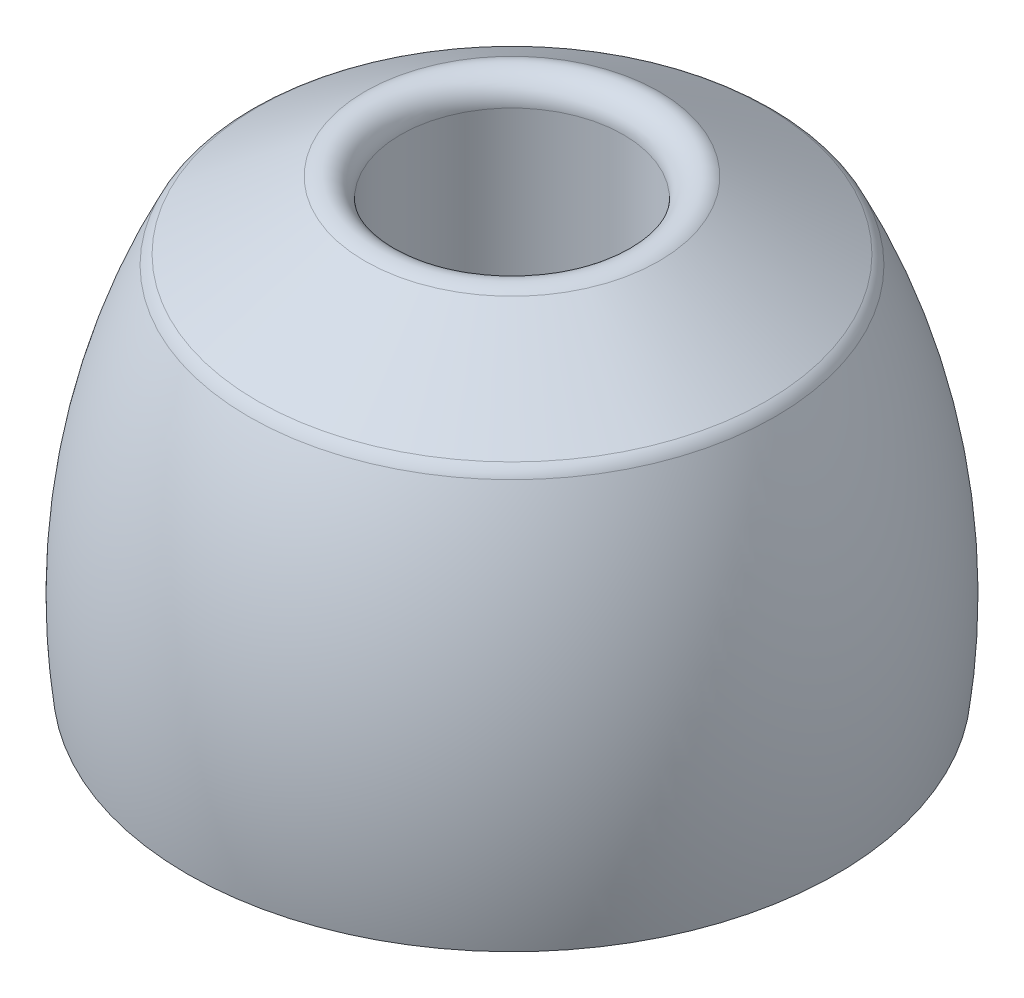
ISO-10303-21;
HEADER;
FILE_DESCRIPTION(('STEP AP214'),'2;1');
FILE_NAME('part.step','',(''),(''),'','','');
FILE_SCHEMA(('AUTOMOTIVE_DESIGN { 1 0 10303 214 1 1 1 1 }'));
ENDSEC;
DATA;
#1=APPLICATION_CONTEXT('core data for automotive mechanical design processes');
#2=APPLICATION_PROTOCOL_DEFINITION('international standard','automotive_design',2000,#1);
#3=PRODUCT_CONTEXT('',#1,'mechanical');
#4=PRODUCT('Part','Part','',(#3));
#5=PRODUCT_RELATED_PRODUCT_CATEGORY('part','',(#4));
#6=PRODUCT_DEFINITION_FORMATION('','',#4);
#7=PRODUCT_DEFINITION_CONTEXT('part definition',#1,'design');
#8=PRODUCT_DEFINITION('design','',#6,#7);
#9=PRODUCT_DEFINITION_SHAPE('','',#8);
#10=(LENGTH_UNIT() NAMED_UNIT(*) SI_UNIT(.MILLI.,.METRE.));
#11=(NAMED_UNIT(*) PLANE_ANGLE_UNIT() SI_UNIT($,.RADIAN.));
#12=(NAMED_UNIT(*) SI_UNIT($,.STERADIAN.) SOLID_ANGLE_UNIT());
#13=UNCERTAINTY_MEASURE_WITH_UNIT(LENGTH_MEASURE(1.E-05),#10,'distance_accuracy_value','');
#14=(GEOMETRIC_REPRESENTATION_CONTEXT(3) GLOBAL_UNCERTAINTY_ASSIGNED_CONTEXT((#13)) GLOBAL_UNIT_ASSIGNED_CONTEXT((#10,
#11,#12)) REPRESENTATION_CONTEXT('',''));
#15=CARTESIAN_POINT('',(0.,0.,0.));
#16=DIRECTION('',(0.,0.,1.));
#17=DIRECTION('',(1.,0.,0.));
#18=AXIS2_PLACEMENT_3D('',#15,#16,#17);
#19=CARTESIAN_POINT('',(0.,0.,0.));
#20=DIRECTION('',(0.,1.,0.));
#21=DIRECTION('',(0.,0.,1.));
#22=AXIS2_PLACEMENT_3D('',#19,#20,#21);
#23=CYLINDRICAL_SURFACE('',#22,2.4);
#24=CARTESIAN_POINT('',(0.,7.59651913615297,0.));
#25=DIRECTION('',(0.,-1.,0.));
#26=DIRECTION('',(0.,0.,-1.));
#27=AXIS2_PLACEMENT_3D('',#24,#25,#26);
#28=CIRCLE('',#27,2.4);
#29=CARTESIAN_POINT('',(0.,7.59651913615297,-2.4));
#30=VERTEX_POINT('',#29);
#31=EDGE_CURVE('E64',#30,#30,#28,.F.);
#32=ORIENTED_EDGE('',*,*,#31,.T.);
#33=EDGE_LOOP('',(#32));
#34=FACE_BOUND('',#33,.T.);
#35=CARTESIAN_POINT('',(0.,0.5,0.));
#36=DIRECTION('',(0.,1.,0.));
#37=DIRECTION('',(0.,0.,1.));
#38=AXIS2_PLACEMENT_3D('',#35,#36,#37);
#39=CIRCLE('',#38,2.4);
#40=CARTESIAN_POINT('',(0.,0.5,2.4));
#41=VERTEX_POINT('',#40);
#42=EDGE_CURVE('E69',#41,#41,#39,.T.);
#43=ORIENTED_EDGE('',*,*,#42,.F.);
#44=EDGE_LOOP('',(#43));
#45=FACE_BOUND('',#44,.T.);
#46=ADVANCED_FACE('F51',(#34,#45),#23,.F.);
#47=CARTESIAN_POINT('',(0.,8.5,0.));
#48=DIRECTION('',(0.,-1.,0.));
#49=DIRECTION('',(0.,0.,-1.));
#50=AXIS2_PLACEMENT_3D('',#47,#48,#49);
#51=CONICAL_SURFACE('',#50,2.4,1.01092285450101);
#52=CARTESIAN_POINT('',(0.,6.56876387739691,0.));
#53=DIRECTION('',(0.,1.,0.));
#54=DIRECTION('',(0.,0.,1.));
#55=AXIS2_PLACEMENT_3D('',#52,#53,#54);
#56=CIRCLE('',#55,5.4812355292414);
#57=CARTESIAN_POINT('',(0.,6.56876387739691,5.4812355292414));
#58=VERTEX_POINT('',#57);
#59=EDGE_CURVE('E56',#58,#58,#56,.T.);
#60=ORIENTED_EDGE('',*,*,#59,.T.);
#61=EDGE_LOOP('',(#60));
#62=FACE_BOUND('',#61,.T.);
#63=CARTESIAN_POINT('',(0.,8.02018029315418,0.));
#64=DIRECTION('',(0.,1.,0.));
#65=DIRECTION('',(0.,0.,1.));
#66=AXIS2_PLACEMENT_3D('',#63,#64,#65);
#67=CIRCLE('',#66,3.16553949621176);
#68=CARTESIAN_POINT('',(0.,8.02018029315418,3.16553949621176));
#69=VERTEX_POINT('',#68);
#70=EDGE_CURVE('E60',#69,#69,#67,.F.);
#71=ORIENTED_EDGE('',*,*,#70,.T.);
#72=EDGE_LOOP('',(#71));
#73=FACE_BOUND('',#72,.T.);
#74=ADVANCED_FACE('F83',(#62,#73),#51,.T.);
#75=CARTESIAN_POINT('',(0.,0.224731900739491,0.));
#76=DIRECTION('',(0.,1.,0.));
#77=DIRECTION('',(0.,0.,1.));
#78=AXIS2_PLACEMENT_3D('',#75,#76,#77);
#79=DEGENERATE_TOROIDAL_SURFACE('',#78,6.78857385713564,13.8848155100534,.F.);
#80=CARTESIAN_POINT('',(0.,6.36626269137959,0.));
#81=DIRECTION('',(0.,-1.,0.));
#82=DIRECTION('',(0.,0.,-1.));
#83=AXIS2_PLACEMENT_3D('',#80,#81,#82);
#84=CIRCLE('',#83,5.66412469762904);
#85=CARTESIAN_POINT('',(0.,6.36626269137959,-5.66412469762904));
#86=VERTEX_POINT('',#85);
#87=EDGE_CURVE('E12',#86,#86,#84,.T.);
#88=ORIENTED_EDGE('',*,*,#87,.T.);
#89=EDGE_LOOP('',(#88));
#90=FACE_BOUND('',#89,.T.);
#91=CARTESIAN_POINT('',(0.,-1.5,0.));
#92=DIRECTION('',(0.,1.,0.));
#93=DIRECTION('',(0.,0.,1.));
#94=AXIS2_PLACEMENT_3D('',#91,#92,#93);
#95=CIRCLE('',#94,6.98870459758067);
#96=CARTESIAN_POINT('',(0.,-1.5,6.98870459758067));
#97=VERTEX_POINT('',#96);
#98=EDGE_CURVE('E73',#97,#97,#95,.T.);
#99=ORIENTED_EDGE('',*,*,#98,.T.);
#100=EDGE_LOOP('',(#99));
#101=FACE_BOUND('',#100,.T.);
#102=ADVANCED_FACE('F80',(#90,#101),#79,.F.);
#103=CARTESIAN_POINT('',(0.,7.59651913615297,0.));
#104=DIRECTION('',(0.,-1.,0.));
#105=DIRECTION('',(0.,0.,-1.));
#106=AXIS2_PLACEMENT_3D('',#103,#104,#105);
#107=TOROIDAL_SURFACE('',#106,2.9,0.5);
#108=ORIENTED_EDGE('',*,*,#70,.F.);
#109=EDGE_LOOP('',(#108));
#110=FACE_BOUND('',#109,.T.);
#111=ORIENTED_EDGE('',*,*,#31,.F.);
#112=EDGE_LOOP('',(#111));
#113=FACE_BOUND('',#112,.T.);
#114=ADVANCED_FACE('F82',(#110,#113),#107,.T.);
#115=CARTESIAN_POINT('',(0.,6.1451027203957,0.));
#116=DIRECTION('',(0.,-1.,0.));
#117=DIRECTION('',(0.,0.,-1.));
#118=AXIS2_PLACEMENT_3D('',#115,#116,#117);
#119=TOROIDAL_SURFACE('',#118,5.21569603302963,0.5);
#120=ORIENTED_EDGE('',*,*,#87,.F.);
#121=EDGE_LOOP('',(#120));
#122=FACE_BOUND('',#121,.T.);
#123=ORIENTED_EDGE('',*,*,#59,.F.);
#124=EDGE_LOOP('',(#123));
#125=FACE_BOUND('',#124,.T.);
#126=ADVANCED_FACE('F52',(#122,#125),#119,.T.);
#127=OPEN_SHELL('',(#46,#74,#102,#114,#126));
#128=SHELL_BASED_SURFACE_MODEL('B2',(#127));
#129=CARTESIAN_POINT('',(0.,0.5,0.));
#130=DIRECTION('',(0.,1.,0.));
#131=DIRECTION('',(0.,0.,1.));
#132=AXIS2_PLACEMENT_3D('',#129,#130,#131);
#133=PLANE('',#132);
#134=CARTESIAN_POINT('',(0.,0.5,0.));
#135=DIRECTION('',(0.,1.,0.));
#136=DIRECTION('',(0.,0.,1.));
#137=AXIS2_PLACEMENT_3D('',#134,#135,#136);
#138=CIRCLE('',#137,2.4);
#139=CARTESIAN_POINT('',(0.,0.5,2.4));
#140=VERTEX_POINT('',#139);
#141=EDGE_CURVE('E50',#140,#140,#138,.T.);
#142=ORIENTED_EDGE('',*,*,#141,.T.);
#143=EDGE_LOOP('',(#142));
#144=FACE_BOUND('',#143,.T.);
#145=CARTESIAN_POINT('',(0.,0.5,0.));
#146=DIRECTION('',(0.,1.,0.));
#147=DIRECTION('',(0.,0.,1.));
#148=AXIS2_PLACEMENT_3D('',#145,#146,#147);
#149=CIRCLE('',#148,1.75);
#150=CARTESIAN_POINT('',(0.,0.5,1.75));
#151=VERTEX_POINT('',#150);
#152=EDGE_CURVE('E160',#151,#151,#149,.T.);
#153=ORIENTED_EDGE('',*,*,#152,.F.);
#154=EDGE_LOOP('',(#153));
#155=FACE_BOUND('',#154,.T.);
#156=ADVANCED_FACE('F149',(#144,#155),#133,.T.);
#157=CARTESIAN_POINT('',(0.,0.,0.));
#158=DIRECTION('',(0.,1.,0.));
#159=DIRECTION('',(0.,0.,1.));
#160=AXIS2_PLACEMENT_3D('',#157,#158,#159);
#161=PLANE('',#160);
#162=CARTESIAN_POINT('',(0.,0.,0.));
#163=DIRECTION('',(0.,1.,0.));
#164=DIRECTION('',(0.,0.,1.));
#165=AXIS2_PLACEMENT_3D('',#162,#163,#164);
#166=CIRCLE('',#165,2.4);
#167=CARTESIAN_POINT('',(0.,0.,2.4));
#168=VERTEX_POINT('',#167);
#169=EDGE_CURVE('E153',#168,#168,#166,.T.);
#170=ORIENTED_EDGE('',*,*,#169,.F.);
#171=EDGE_LOOP('',(#170));
#172=FACE_BOUND('',#171,.T.);
#173=CARTESIAN_POINT('',(0.,0.,0.));
#174=DIRECTION('',(0.,1.,0.));
#175=DIRECTION('',(0.,0.,1.));
#176=AXIS2_PLACEMENT_3D('',#173,#174,#175);
#177=CIRCLE('',#176,1.75);
#178=CARTESIAN_POINT('',(0.,0.,1.75));
#179=VERTEX_POINT('',#178);
#180=EDGE_CURVE('E162',#179,#179,#177,.T.);
#181=ORIENTED_EDGE('',*,*,#180,.T.);
#182=EDGE_LOOP('',(#181));
#183=FACE_BOUND('',#182,.T.);
#184=ADVANCED_FACE('F172',(#172,#183),#161,.F.);
#185=CARTESIAN_POINT('',(0.,0.5,0.));
#186=DIRECTION('',(0.,-1.,0.));
#187=DIRECTION('',(0.,0.,-1.));
#188=AXIS2_PLACEMENT_3D('',#185,#186,#187);
#189=CYLINDRICAL_SURFACE('',#188,2.4);
#190=ORIENTED_EDGE('',*,*,#141,.F.);
#191=EDGE_LOOP('',(#190));
#192=FACE_BOUND('',#191,.T.);
#193=ORIENTED_EDGE('',*,*,#169,.T.);
#194=EDGE_LOOP('',(#193));
#195=FACE_BOUND('',#194,.T.);
#196=ADVANCED_FACE('F151',(#192,#195),#189,.T.);
#197=CARTESIAN_POINT('',(0.,0.5,0.));
#198=DIRECTION('',(0.,-1.,0.));
#199=DIRECTION('',(0.,0.,-1.));
#200=AXIS2_PLACEMENT_3D('',#197,#198,#199);
#201=CYLINDRICAL_SURFACE('',#200,1.75);
#202=ORIENTED_EDGE('',*,*,#152,.T.);
#203=EDGE_LOOP('',(#202));
#204=FACE_BOUND('',#203,.T.);
#205=ORIENTED_EDGE('',*,*,#180,.F.);
#206=EDGE_LOOP('',(#205));
#207=FACE_BOUND('',#206,.T.);
#208=ADVANCED_FACE('F168',(#204,#207),#201,.F.);
#209=CLOSED_SHELL('',(#156,#184,#196,#208));
#210=MANIFOLD_SOLID_BREP('B7',#209);
#211=ADVANCED_BREP_SHAPE_REPRESENTATION('',(#18,#210),#14);
#212=MANIFOLD_SURFACE_SHAPE_REPRESENTATION('',(#18,#128),#14);
#213=SHAPE_REPRESENTATION('',(#18),#14);
#214=SHAPE_DEFINITION_REPRESENTATION(#9,#213);
#215=SHAPE_REPRESENTATION_RELATIONSHIP('','',#213,#211);
#216=SHAPE_REPRESENTATION_RELATIONSHIP('','',#213,#212);
ENDSEC;
END-ISO-10303-21;
